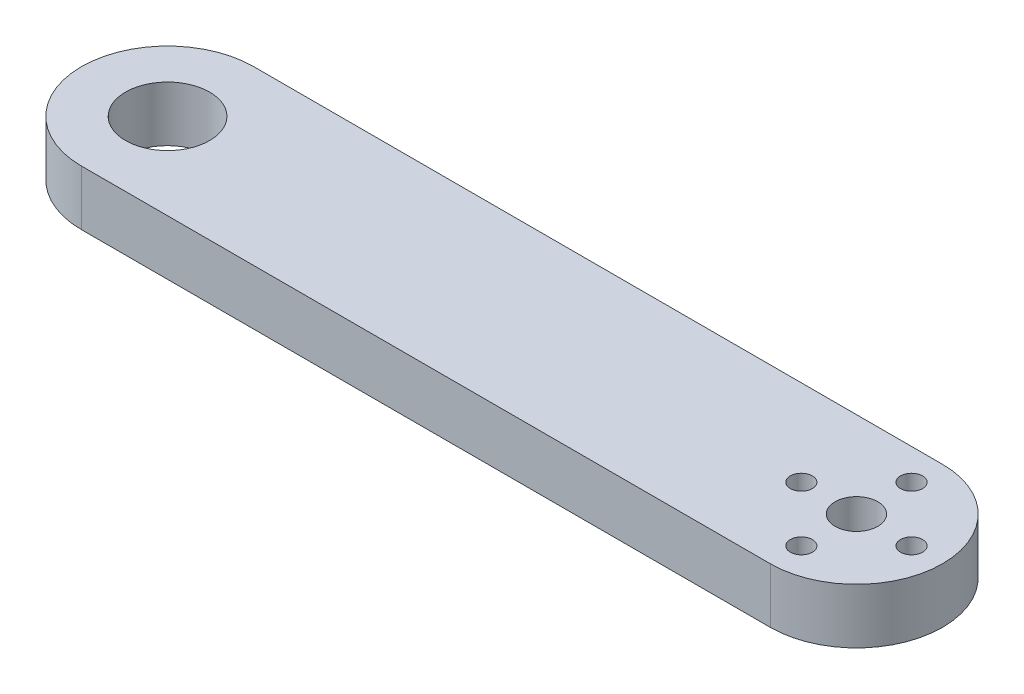
ISO-10303-21;
HEADER;
FILE_DESCRIPTION(('STEP AP214'),'2;1');
FILE_NAME('part.step','',(''),(''),'','','');
FILE_SCHEMA(('AUTOMOTIVE_DESIGN { 1 0 10303 214 1 1 1 1 }'));
ENDSEC;
DATA;
#1=APPLICATION_CONTEXT('core data for automotive mechanical design processes');
#2=APPLICATION_PROTOCOL_DEFINITION('international standard','automotive_design',2000,#1);
#3=PRODUCT_CONTEXT('',#1,'mechanical');
#4=PRODUCT('Part','Part','',(#3));
#5=PRODUCT_RELATED_PRODUCT_CATEGORY('part','',(#4));
#6=PRODUCT_DEFINITION_FORMATION('','',#4);
#7=PRODUCT_DEFINITION_CONTEXT('part definition',#1,'design');
#8=PRODUCT_DEFINITION('design','',#6,#7);
#9=PRODUCT_DEFINITION_SHAPE('','',#8);
#10=(LENGTH_UNIT() NAMED_UNIT(*) SI_UNIT(.MILLI.,.METRE.));
#11=(NAMED_UNIT(*) PLANE_ANGLE_UNIT() SI_UNIT($,.RADIAN.));
#12=(NAMED_UNIT(*) SI_UNIT($,.STERADIAN.) SOLID_ANGLE_UNIT());
#13=UNCERTAINTY_MEASURE_WITH_UNIT(LENGTH_MEASURE(1.E-05),#10,'distance_accuracy_value','');
#14=(GEOMETRIC_REPRESENTATION_CONTEXT(3) GLOBAL_UNCERTAINTY_ASSIGNED_CONTEXT((#13)) GLOBAL_UNIT_ASSIGNED_CONTEXT((#10,
#11,#12)) REPRESENTATION_CONTEXT('',''));
#15=CARTESIAN_POINT('',(0.,0.,0.));
#16=DIRECTION('',(0.,0.,1.));
#17=DIRECTION('',(1.,0.,0.));
#18=AXIS2_PLACEMENT_3D('',#15,#16,#17);
#19=CARTESIAN_POINT('',(50.,8.,0.));
#20=DIRECTION('',(0.,-1.,0.));
#21=DIRECTION('',(0.,0.,-1.));
#22=AXIS2_PLACEMENT_3D('',#19,#20,#21);
#23=CYLINDRICAL_SURFACE('',#22,12.5);
#24=CARTESIAN_POINT('',(50.,0.,0.));
#25=DIRECTION('',(0.,1.,0.));
#26=DIRECTION('',(0.,0.,-1.));
#27=AXIS2_PLACEMENT_3D('',#24,#25,#26);
#28=CIRCLE('',#27,12.5);
#29=CARTESIAN_POINT('',(50.,0.,12.5));
#30=VERTEX_POINT('',#29);
#31=CARTESIAN_POINT('',(50.,0.,-12.5));
#32=VERTEX_POINT('',#31);
#33=EDGE_CURVE('E107',#30,#32,#28,.T.);
#34=ORIENTED_EDGE('',*,*,#33,.T.);
#35=DIRECTION('',(0.,-1.,0.));
#36=VECTOR('',#35,1.);
#37=CARTESIAN_POINT('',(50.,8.,-12.5));
#38=LINE('',#37,#36);
#39=CARTESIAN_POINT('',(50.,8.,-12.5));
#40=VERTEX_POINT('',#39);
#41=EDGE_CURVE('E11',#40,#32,#38,.T.);
#42=ORIENTED_EDGE('',*,*,#41,.F.);
#43=CARTESIAN_POINT('',(50.,8.,0.));
#44=DIRECTION('',(0.,1.,0.));
#45=DIRECTION('',(0.,0.,-1.));
#46=AXIS2_PLACEMENT_3D('',#43,#44,#45);
#47=CIRCLE('',#46,12.5);
#48=CARTESIAN_POINT('',(50.,8.,12.5));
#49=VERTEX_POINT('',#48);
#50=EDGE_CURVE('E91',#49,#40,#47,.T.);
#51=ORIENTED_EDGE('',*,*,#50,.F.);
#52=DIRECTION('',(0.,-1.,0.));
#53=VECTOR('',#52,1.);
#54=CARTESIAN_POINT('',(50.,8.,12.5));
#55=LINE('',#54,#53);
#56=EDGE_CURVE('E103',#49,#30,#55,.T.);
#57=ORIENTED_EDGE('',*,*,#56,.T.);
#58=EDGE_LOOP('',(#34,#42,#51,#57));
#59=FACE_BOUND('',#58,.T.);
#60=ADVANCED_FACE('F39',(#59),#23,.T.);
#61=CARTESIAN_POINT('',(-50.,8.,-12.5));
#62=DIRECTION('',(0.,0.,1.));
#63=DIRECTION('',(1.,0.,0.));
#64=AXIS2_PLACEMENT_3D('',#61,#62,#63);
#65=PLANE('',#64);
#66=DIRECTION('',(-1.,0.,0.));
#67=VECTOR('',#66,1.);
#68=CARTESIAN_POINT('',(-50.,0.,-12.5));
#69=LINE('',#68,#67);
#70=CARTESIAN_POINT('',(-50.,0.,-12.5));
#71=VERTEX_POINT('',#70);
#72=EDGE_CURVE('E96',#32,#71,#69,.T.);
#73=ORIENTED_EDGE('',*,*,#72,.T.);
#74=DIRECTION('',(0.,-1.,0.));
#75=VECTOR('',#74,1.);
#76=CARTESIAN_POINT('',(-50.,8.,-12.5));
#77=LINE('',#76,#75);
#78=CARTESIAN_POINT('',(-50.,8.,-12.5));
#79=VERTEX_POINT('',#78);
#80=EDGE_CURVE('E48',#79,#71,#77,.T.);
#81=ORIENTED_EDGE('',*,*,#80,.F.);
#82=DIRECTION('',(-1.,0.,0.));
#83=VECTOR('',#82,1.);
#84=CARTESIAN_POINT('',(-50.,8.,-12.5));
#85=LINE('',#84,#83);
#86=EDGE_CURVE('E86',#40,#79,#85,.T.);
#87=ORIENTED_EDGE('',*,*,#86,.F.);
#88=ORIENTED_EDGE('',*,*,#41,.T.);
#89=EDGE_LOOP('',(#73,#81,#87,#88));
#90=FACE_BOUND('',#89,.T.);
#91=ADVANCED_FACE('F95',(#90),#65,.F.);
#92=CARTESIAN_POINT('',(-50.,8.,0.));
#93=DIRECTION('',(0.,-1.,0.));
#94=DIRECTION('',(0.,0.,-1.));
#95=AXIS2_PLACEMENT_3D('',#92,#93,#94);
#96=CYLINDRICAL_SURFACE('',#95,12.5);
#97=CARTESIAN_POINT('',(-50.,0.,0.));
#98=DIRECTION('',(0.,1.,0.));
#99=DIRECTION('',(0.,0.,1.));
#100=AXIS2_PLACEMENT_3D('',#97,#98,#99);
#101=CIRCLE('',#100,12.5);
#102=CARTESIAN_POINT('',(-50.,0.,12.5));
#103=VERTEX_POINT('',#102);
#104=EDGE_CURVE('E73',#71,#103,#101,.T.);
#105=ORIENTED_EDGE('',*,*,#104,.T.);
#106=DIRECTION('',(0.,-1.,0.));
#107=VECTOR('',#106,1.);
#108=CARTESIAN_POINT('',(-50.,8.,12.5));
#109=LINE('',#108,#107);
#110=CARTESIAN_POINT('',(-50.,8.,12.5));
#111=VERTEX_POINT('',#110);
#112=EDGE_CURVE('E98',#111,#103,#109,.T.);
#113=ORIENTED_EDGE('',*,*,#112,.F.);
#114=CARTESIAN_POINT('',(-50.,8.,0.));
#115=DIRECTION('',(0.,1.,0.));
#116=DIRECTION('',(0.,0.,1.));
#117=AXIS2_PLACEMENT_3D('',#114,#115,#116);
#118=CIRCLE('',#117,12.5);
#119=EDGE_CURVE('E89',#79,#111,#118,.T.);
#120=ORIENTED_EDGE('',*,*,#119,.F.);
#121=ORIENTED_EDGE('',*,*,#80,.T.);
#122=EDGE_LOOP('',(#105,#113,#120,#121));
#123=FACE_BOUND('',#122,.T.);
#124=ADVANCED_FACE('F99',(#123),#96,.T.);
#125=CARTESIAN_POINT('',(-50.,8.,12.5));
#126=DIRECTION('',(0.,0.,-1.));
#127=DIRECTION('',(-1.,0.,0.));
#128=AXIS2_PLACEMENT_3D('',#125,#126,#127);
#129=PLANE('',#128);
#130=DIRECTION('',(1.,0.,0.));
#131=VECTOR('',#130,1.);
#132=CARTESIAN_POINT('',(-50.,0.,12.5));
#133=LINE('',#132,#131);
#134=EDGE_CURVE('E79',#103,#30,#133,.T.);
#135=ORIENTED_EDGE('',*,*,#134,.T.);
#136=ORIENTED_EDGE('',*,*,#56,.F.);
#137=DIRECTION('',(1.,0.,0.));
#138=VECTOR('',#137,1.);
#139=CARTESIAN_POINT('',(-50.,8.,12.5));
#140=LINE('',#139,#138);
#141=EDGE_CURVE('E56',#111,#49,#140,.T.);
#142=ORIENTED_EDGE('',*,*,#141,.F.);
#143=ORIENTED_EDGE('',*,*,#112,.T.);
#144=EDGE_LOOP('',(#135,#136,#142,#143));
#145=FACE_BOUND('',#144,.T.);
#146=ADVANCED_FACE('F121',(#145),#129,.F.);
#147=CARTESIAN_POINT('',(50.,8.,0.));
#148=DIRECTION('',(0.,-1.,0.));
#149=DIRECTION('',(0.,0.,-1.));
#150=AXIS2_PLACEMENT_3D('',#147,#148,#149);
#151=PLANE('',#150);
#152=CARTESIAN_POINT('',(-50.,8.,0.));
#153=DIRECTION('',(0.,1.,0.));
#154=DIRECTION('',(0.,0.,1.));
#155=AXIS2_PLACEMENT_3D('',#152,#153,#154);
#156=CIRCLE('',#155,6.1);
#157=CARTESIAN_POINT('',(-50.,8.,6.1));
#158=VERTEX_POINT('',#157);
#159=EDGE_CURVE('E168',#158,#158,#156,.T.);
#160=ORIENTED_EDGE('',*,*,#159,.F.);
#161=EDGE_LOOP('',(#160));
#162=FACE_BOUND('',#161,.T.);
#163=CARTESIAN_POINT('',(50.,8.,8.));
#164=DIRECTION('',(0.,1.,0.));
#165=DIRECTION('',(0.,0.,1.));
#166=AXIS2_PLACEMENT_3D('',#163,#164,#165);
#167=CIRCLE('',#166,1.6);
#168=CARTESIAN_POINT('',(50.,8.,9.6));
#169=VERTEX_POINT('',#168);
#170=EDGE_CURVE('E137',#169,#169,#167,.T.);
#171=ORIENTED_EDGE('',*,*,#170,.F.);
#172=EDGE_LOOP('',(#171));
#173=FACE_BOUND('',#172,.T.);
#174=CARTESIAN_POINT('',(58.,8.,0.));
#175=DIRECTION('',(0.,1.,0.));
#176=DIRECTION('',(0.,0.,1.));
#177=AXIS2_PLACEMENT_3D('',#174,#175,#176);
#178=CIRCLE('',#177,1.6);
#179=CARTESIAN_POINT('',(58.,8.,1.6));
#180=VERTEX_POINT('',#179);
#181=EDGE_CURVE('E161',#180,#180,#178,.T.);
#182=ORIENTED_EDGE('',*,*,#181,.F.);
#183=EDGE_LOOP('',(#182));
#184=FACE_BOUND('',#183,.T.);
#185=CARTESIAN_POINT('',(50.,8.,0.));
#186=DIRECTION('',(0.,1.,0.));
#187=DIRECTION('',(0.,0.,1.));
#188=AXIS2_PLACEMENT_3D('',#185,#186,#187);
#189=CIRCLE('',#188,3.1);
#190=CARTESIAN_POINT('',(50.,8.,3.1));
#191=VERTEX_POINT('',#190);
#192=EDGE_CURVE('E138',#191,#191,#189,.T.);
#193=ORIENTED_EDGE('',*,*,#192,.F.);
#194=EDGE_LOOP('',(#193));
#195=FACE_BOUND('',#194,.T.);
#196=CARTESIAN_POINT('',(50.,8.,-8.));
#197=DIRECTION('',(0.,1.,0.));
#198=DIRECTION('',(0.,0.,1.));
#199=AXIS2_PLACEMENT_3D('',#196,#197,#198);
#200=CIRCLE('',#199,1.6);
#201=CARTESIAN_POINT('',(50.,8.,-6.4));
#202=VERTEX_POINT('',#201);
#203=EDGE_CURVE('E147',#202,#202,#200,.T.);
#204=ORIENTED_EDGE('',*,*,#203,.F.);
#205=EDGE_LOOP('',(#204));
#206=FACE_BOUND('',#205,.T.);
#207=CARTESIAN_POINT('',(42.,8.,0.));
#208=DIRECTION('',(0.,1.,0.));
#209=DIRECTION('',(0.,0.,1.));
#210=AXIS2_PLACEMENT_3D('',#207,#208,#209);
#211=CIRCLE('',#210,1.6);
#212=CARTESIAN_POINT('',(42.,8.,1.6));
#213=VERTEX_POINT('',#212);
#214=EDGE_CURVE('E128',#213,#213,#211,.T.);
#215=ORIENTED_EDGE('',*,*,#214,.F.);
#216=EDGE_LOOP('',(#215));
#217=FACE_BOUND('',#216,.T.);
#218=ORIENTED_EDGE('',*,*,#50,.T.);
#219=ORIENTED_EDGE('',*,*,#86,.T.);
#220=ORIENTED_EDGE('',*,*,#119,.T.);
#221=ORIENTED_EDGE('',*,*,#141,.T.);
#222=EDGE_LOOP('',(#218,#219,#220,#221));
#223=FACE_BOUND('',#222,.T.);
#224=ADVANCED_FACE('F87',(#162,#173,#184,#195,#206,#217,#223),#151,.F.);
#225=CARTESIAN_POINT('',(50.,0.,0.));
#226=DIRECTION('',(0.,-1.,0.));
#227=DIRECTION('',(0.,0.,-1.));
#228=AXIS2_PLACEMENT_3D('',#225,#226,#227);
#229=PLANE('',#228);
#230=CARTESIAN_POINT('',(-50.,0.,0.));
#231=DIRECTION('',(0.,1.,0.));
#232=DIRECTION('',(0.,0.,1.));
#233=AXIS2_PLACEMENT_3D('',#230,#231,#232);
#234=CIRCLE('',#233,6.1);
#235=CARTESIAN_POINT('',(-50.,0.,6.1));
#236=VERTEX_POINT('',#235);
#237=EDGE_CURVE('E133',#236,#236,#234,.T.);
#238=ORIENTED_EDGE('',*,*,#237,.T.);
#239=EDGE_LOOP('',(#238));
#240=FACE_BOUND('',#239,.T.);
#241=CARTESIAN_POINT('',(50.,0.,8.));
#242=DIRECTION('',(0.,1.,0.));
#243=DIRECTION('',(0.,0.,1.));
#244=AXIS2_PLACEMENT_3D('',#241,#242,#243);
#245=CIRCLE('',#244,1.6);
#246=CARTESIAN_POINT('',(50.,0.,9.6));
#247=VERTEX_POINT('',#246);
#248=EDGE_CURVE('E157',#247,#247,#245,.T.);
#249=ORIENTED_EDGE('',*,*,#248,.T.);
#250=EDGE_LOOP('',(#249));
#251=FACE_BOUND('',#250,.T.);
#252=CARTESIAN_POINT('',(58.,0.,0.));
#253=DIRECTION('',(0.,1.,0.));
#254=DIRECTION('',(0.,0.,1.));
#255=AXIS2_PLACEMENT_3D('',#252,#253,#254);
#256=CIRCLE('',#255,1.6);
#257=CARTESIAN_POINT('',(58.,0.,1.6));
#258=VERTEX_POINT('',#257);
#259=EDGE_CURVE('E143',#258,#258,#256,.T.);
#260=ORIENTED_EDGE('',*,*,#259,.T.);
#261=EDGE_LOOP('',(#260));
#262=FACE_BOUND('',#261,.T.);
#263=CARTESIAN_POINT('',(50.,0.,0.));
#264=DIRECTION('',(0.,1.,0.));
#265=DIRECTION('',(0.,0.,1.));
#266=AXIS2_PLACEMENT_3D('',#263,#264,#265);
#267=CIRCLE('',#266,3.1);
#268=CARTESIAN_POINT('',(50.,0.,3.1));
#269=VERTEX_POINT('',#268);
#270=EDGE_CURVE('E142',#269,#269,#267,.T.);
#271=ORIENTED_EDGE('',*,*,#270,.T.);
#272=EDGE_LOOP('',(#271));
#273=FACE_BOUND('',#272,.T.);
#274=CARTESIAN_POINT('',(50.,0.,-8.));
#275=DIRECTION('',(0.,1.,0.));
#276=DIRECTION('',(0.,0.,1.));
#277=AXIS2_PLACEMENT_3D('',#274,#275,#276);
#278=CIRCLE('',#277,1.6);
#279=CARTESIAN_POINT('',(50.,0.,-6.4));
#280=VERTEX_POINT('',#279);
#281=EDGE_CURVE('E111',#280,#280,#278,.T.);
#282=ORIENTED_EDGE('',*,*,#281,.T.);
#283=EDGE_LOOP('',(#282));
#284=FACE_BOUND('',#283,.T.);
#285=CARTESIAN_POINT('',(42.,0.,0.));
#286=DIRECTION('',(0.,1.,0.));
#287=DIRECTION('',(0.,0.,1.));
#288=AXIS2_PLACEMENT_3D('',#285,#286,#287);
#289=CIRCLE('',#288,1.6);
#290=CARTESIAN_POINT('',(42.,0.,1.6));
#291=VERTEX_POINT('',#290);
#292=EDGE_CURVE('E132',#291,#291,#289,.T.);
#293=ORIENTED_EDGE('',*,*,#292,.T.);
#294=EDGE_LOOP('',(#293));
#295=FACE_BOUND('',#294,.T.);
#296=ORIENTED_EDGE('',*,*,#33,.F.);
#297=ORIENTED_EDGE('',*,*,#134,.F.);
#298=ORIENTED_EDGE('',*,*,#104,.F.);
#299=ORIENTED_EDGE('',*,*,#72,.F.);
#300=EDGE_LOOP('',(#296,#297,#298,#299));
#301=FACE_BOUND('',#300,.T.);
#302=ADVANCED_FACE('F124',(#240,#251,#262,#273,#284,#295,#301),#229,.T.);
#303=CARTESIAN_POINT('',(42.,0.,0.));
#304=DIRECTION('',(0.,1.,0.));
#305=DIRECTION('',(0.,0.,1.));
#306=AXIS2_PLACEMENT_3D('',#303,#304,#305);
#307=CYLINDRICAL_SURFACE('',#306,1.6);
#308=ORIENTED_EDGE('',*,*,#292,.F.);
#309=EDGE_LOOP('',(#308));
#310=FACE_BOUND('',#309,.T.);
#311=ORIENTED_EDGE('',*,*,#214,.T.);
#312=EDGE_LOOP('',(#311));
#313=FACE_BOUND('',#312,.T.);
#314=ADVANCED_FACE('F198',(#310,#313),#307,.F.);
#315=CARTESIAN_POINT('',(50.,0.,-8.));
#316=DIRECTION('',(0.,1.,0.));
#317=DIRECTION('',(0.,0.,1.));
#318=AXIS2_PLACEMENT_3D('',#315,#316,#317);
#319=CYLINDRICAL_SURFACE('',#318,1.6);
#320=ORIENTED_EDGE('',*,*,#281,.F.);
#321=EDGE_LOOP('',(#320));
#322=FACE_BOUND('',#321,.T.);
#323=ORIENTED_EDGE('',*,*,#203,.T.);
#324=EDGE_LOOP('',(#323));
#325=FACE_BOUND('',#324,.T.);
#326=ADVANCED_FACE('F200',(#322,#325),#319,.F.);
#327=CARTESIAN_POINT('',(50.,0.,0.));
#328=DIRECTION('',(0.,1.,0.));
#329=DIRECTION('',(0.,0.,1.));
#330=AXIS2_PLACEMENT_3D('',#327,#328,#329);
#331=CYLINDRICAL_SURFACE('',#330,3.1);
#332=ORIENTED_EDGE('',*,*,#270,.F.);
#333=EDGE_LOOP('',(#332));
#334=FACE_BOUND('',#333,.T.);
#335=ORIENTED_EDGE('',*,*,#192,.T.);
#336=EDGE_LOOP('',(#335));
#337=FACE_BOUND('',#336,.T.);
#338=ADVANCED_FACE('F207',(#334,#337),#331,.F.);
#339=CARTESIAN_POINT('',(58.,0.,0.));
#340=DIRECTION('',(0.,1.,0.));
#341=DIRECTION('',(0.,0.,1.));
#342=AXIS2_PLACEMENT_3D('',#339,#340,#341);
#343=CYLINDRICAL_SURFACE('',#342,1.6);
#344=ORIENTED_EDGE('',*,*,#259,.F.);
#345=EDGE_LOOP('',(#344));
#346=FACE_BOUND('',#345,.T.);
#347=ORIENTED_EDGE('',*,*,#181,.T.);
#348=EDGE_LOOP('',(#347));
#349=FACE_BOUND('',#348,.T.);
#350=ADVANCED_FACE('F251',(#346,#349),#343,.F.);
#351=CARTESIAN_POINT('',(50.,0.,8.));
#352=DIRECTION('',(0.,1.,0.));
#353=DIRECTION('',(0.,0.,1.));
#354=AXIS2_PLACEMENT_3D('',#351,#352,#353);
#355=CYLINDRICAL_SURFACE('',#354,1.6);
#356=ORIENTED_EDGE('',*,*,#248,.F.);
#357=EDGE_LOOP('',(#356));
#358=FACE_BOUND('',#357,.T.);
#359=ORIENTED_EDGE('',*,*,#170,.T.);
#360=EDGE_LOOP('',(#359));
#361=FACE_BOUND('',#360,.T.);
#362=ADVANCED_FACE('F181',(#358,#361),#355,.F.);
#363=CARTESIAN_POINT('',(-50.,0.,0.));
#364=DIRECTION('',(0.,1.,0.));
#365=DIRECTION('',(0.,0.,1.));
#366=AXIS2_PLACEMENT_3D('',#363,#364,#365);
#367=CYLINDRICAL_SURFACE('',#366,6.1);
#368=ORIENTED_EDGE('',*,*,#237,.F.);
#369=EDGE_LOOP('',(#368));
#370=FACE_BOUND('',#369,.T.);
#371=ORIENTED_EDGE('',*,*,#159,.T.);
#372=EDGE_LOOP('',(#371));
#373=FACE_BOUND('',#372,.T.);
#374=ADVANCED_FACE('F178',(#370,#373),#367,.F.);
#375=CLOSED_SHELL('',(#60,#91,#124,#146,#224,#302,#314,#326,#338,#350,#362,#374));
#376=MANIFOLD_SOLID_BREP('B2',#375);
#377=ADVANCED_BREP_SHAPE_REPRESENTATION('',(#18,#376),#14);
#378=SHAPE_DEFINITION_REPRESENTATION(#9,#377);
ENDSEC;
END-ISO-10303-21;
